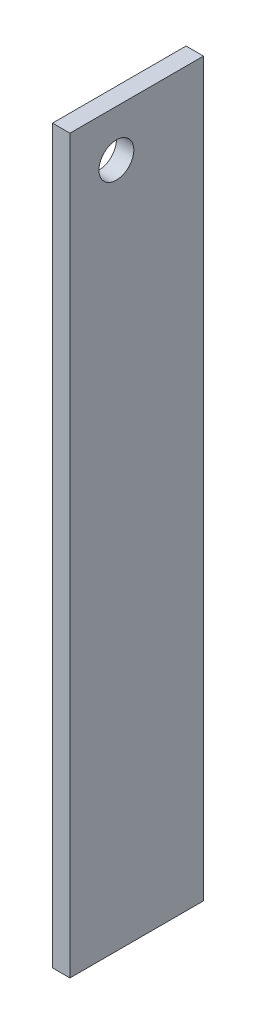
ISO-10303-21;
HEADER;
FILE_DESCRIPTION(('STEP AP214'),'2;1');
FILE_NAME('part.step','',(''),(''),'','','');
FILE_SCHEMA(('AUTOMOTIVE_DESIGN { 1 0 10303 214 1 1 1 1 }'));
ENDSEC;
DATA;
#1=APPLICATION_CONTEXT('core data for automotive mechanical design processes');
#2=APPLICATION_PROTOCOL_DEFINITION('international standard','automotive_design',2000,#1);
#3=PRODUCT_CONTEXT('',#1,'mechanical');
#4=PRODUCT('Part','Part','',(#3));
#5=PRODUCT_RELATED_PRODUCT_CATEGORY('part','',(#4));
#6=PRODUCT_DEFINITION_FORMATION('','',#4);
#7=PRODUCT_DEFINITION_CONTEXT('part definition',#1,'design');
#8=PRODUCT_DEFINITION('design','',#6,#7);
#9=PRODUCT_DEFINITION_SHAPE('','',#8);
#10=(LENGTH_UNIT() NAMED_UNIT(*) SI_UNIT(.MILLI.,.METRE.));
#11=(NAMED_UNIT(*) PLANE_ANGLE_UNIT() SI_UNIT($,.RADIAN.));
#12=(NAMED_UNIT(*) SI_UNIT($,.STERADIAN.) SOLID_ANGLE_UNIT());
#13=UNCERTAINTY_MEASURE_WITH_UNIT(LENGTH_MEASURE(1.E-05),#10,'distance_accuracy_value','');
#14=(GEOMETRIC_REPRESENTATION_CONTEXT(3) GLOBAL_UNCERTAINTY_ASSIGNED_CONTEXT((#13)) GLOBAL_UNIT_ASSIGNED_CONTEXT((#10,
#11,#12)) REPRESENTATION_CONTEXT('',''));
#15=CARTESIAN_POINT('',(0.,0.,0.));
#16=DIRECTION('',(0.,0.,1.));
#17=DIRECTION('',(1.,0.,0.));
#18=AXIS2_PLACEMENT_3D('',#15,#16,#17);
#19=CARTESIAN_POINT('',(76.1999999999999,6400.8,-584.2));
#20=DIRECTION('',(-1.,0.,0.));
#21=DIRECTION('',(0.,0.,1.));
#22=AXIS2_PLACEMENT_3D('',#19,#20,#21);
#23=PLANE('',#22);
#24=CARTESIAN_POINT('',(76.2000000000002,5994.4,177.8));
#25=DIRECTION('',(-1.,0.,0.));
#26=DIRECTION('',(0.,0.,1.));
#27=AXIS2_PLACEMENT_3D('',#24,#25,#26);
#28=CIRCLE('',#27,152.4);
#29=CARTESIAN_POINT('',(76.2000000000002,5994.4,330.2));
#30=VERTEX_POINT('',#29);
#31=EDGE_CURVE('E111',#30,#30,#28,.T.);
#32=ORIENTED_EDGE('',*,*,#31,.T.);
#33=EDGE_LOOP('',(#32));
#34=FACE_BOUND('',#33,.T.);
#35=DIRECTION('',(0.,0.,-1.));
#36=VECTOR('',#35,1.);
#37=CARTESIAN_POINT('',(76.1999999999999,0.,-584.2));
#38=LINE('',#37,#36);
#39=CARTESIAN_POINT('',(76.2000000000001,0.,584.2));
#40=VERTEX_POINT('',#39);
#41=CARTESIAN_POINT('',(76.1999999999999,0.,-584.2));
#42=VERTEX_POINT('',#41);
#43=EDGE_CURVE('E98',#40,#42,#38,.T.);
#44=ORIENTED_EDGE('',*,*,#43,.T.);
#45=DIRECTION('',(0.,-1.,0.));
#46=VECTOR('',#45,1.);
#47=CARTESIAN_POINT('',(76.1999999999999,6400.8,-584.2));
#48=LINE('',#47,#46);
#49=CARTESIAN_POINT('',(76.1999999999999,6400.8,-584.2));
#50=VERTEX_POINT('',#49);
#51=EDGE_CURVE('E11',#50,#42,#48,.T.);
#52=ORIENTED_EDGE('',*,*,#51,.F.);
#53=DIRECTION('',(0.,0.,-1.));
#54=VECTOR('',#53,1.);
#55=CARTESIAN_POINT('',(76.1999999999999,6400.8,-584.2));
#56=LINE('',#55,#54);
#57=CARTESIAN_POINT('',(76.2000000000001,6400.8,584.2));
#58=VERTEX_POINT('',#57);
#59=EDGE_CURVE('E85',#58,#50,#56,.T.);
#60=ORIENTED_EDGE('',*,*,#59,.F.);
#61=DIRECTION('',(0.,-1.,0.));
#62=VECTOR('',#61,1.);
#63=CARTESIAN_POINT('',(76.2000000000001,6400.8,584.2));
#64=LINE('',#63,#62);
#65=EDGE_CURVE('E94',#58,#40,#64,.T.);
#66=ORIENTED_EDGE('',*,*,#65,.T.);
#67=EDGE_LOOP('',(#44,#52,#60,#66));
#68=FACE_BOUND('',#67,.T.);
#69=ADVANCED_FACE('F33',(#34,#68),#23,.F.);
#70=CARTESIAN_POINT('',(-76.2000000000001,6400.8,-584.2));
#71=DIRECTION('',(0.,0.,1.));
#72=DIRECTION('',(1.,0.,0.));
#73=AXIS2_PLACEMENT_3D('',#70,#71,#72);
#74=PLANE('',#73);
#75=DIRECTION('',(-1.,0.,0.));
#76=VECTOR('',#75,1.);
#77=CARTESIAN_POINT('',(-76.2000000000001,0.,-584.2));
#78=LINE('',#77,#76);
#79=CARTESIAN_POINT('',(-76.2000000000001,0.,-584.2));
#80=VERTEX_POINT('',#79);
#81=EDGE_CURVE('E89',#42,#80,#78,.T.);
#82=ORIENTED_EDGE('',*,*,#81,.T.);
#83=DIRECTION('',(0.,-1.,0.));
#84=VECTOR('',#83,1.);
#85=CARTESIAN_POINT('',(-76.2000000000001,6400.8,-584.2));
#86=LINE('',#85,#84);
#87=CARTESIAN_POINT('',(-76.2000000000001,6400.8,-584.2));
#88=VERTEX_POINT('',#87);
#89=EDGE_CURVE('E42',#88,#80,#86,.T.);
#90=ORIENTED_EDGE('',*,*,#89,.F.);
#91=DIRECTION('',(-1.,0.,0.));
#92=VECTOR('',#91,1.);
#93=CARTESIAN_POINT('',(-76.2000000000001,6400.8,-584.2));
#94=LINE('',#93,#92);
#95=EDGE_CURVE('E80',#50,#88,#94,.T.);
#96=ORIENTED_EDGE('',*,*,#95,.F.);
#97=ORIENTED_EDGE('',*,*,#51,.T.);
#98=EDGE_LOOP('',(#82,#90,#96,#97));
#99=FACE_BOUND('',#98,.T.);
#100=ADVANCED_FACE('F88',(#99),#74,.F.);
#101=CARTESIAN_POINT('',(-76.2000000000001,6400.8,-584.2));
#102=DIRECTION('',(1.,0.,0.));
#103=DIRECTION('',(0.,0.,-1.));
#104=AXIS2_PLACEMENT_3D('',#101,#102,#103);
#105=PLANE('',#104);
#106=CARTESIAN_POINT('',(-76.2,5994.4,177.8));
#107=DIRECTION('',(1.,0.,0.));
#108=DIRECTION('',(0.,0.,-1.));
#109=AXIS2_PLACEMENT_3D('',#106,#107,#108);
#110=CIRCLE('',#109,152.4);
#111=CARTESIAN_POINT('',(-76.2,5994.4,25.4));
#112=VERTEX_POINT('',#111);
#113=EDGE_CURVE('E36',#112,#112,#110,.T.);
#114=ORIENTED_EDGE('',*,*,#113,.T.);
#115=EDGE_LOOP('',(#114));
#116=FACE_BOUND('',#115,.T.);
#117=DIRECTION('',(0.,0.,1.));
#118=VECTOR('',#117,1.);
#119=CARTESIAN_POINT('',(-76.2000000000001,0.,-584.2));
#120=LINE('',#119,#118);
#121=CARTESIAN_POINT('',(-76.1999999999999,0.,584.2));
#122=VERTEX_POINT('',#121);
#123=EDGE_CURVE('E67',#80,#122,#120,.T.);
#124=ORIENTED_EDGE('',*,*,#123,.T.);
#125=DIRECTION('',(0.,-1.,0.));
#126=VECTOR('',#125,1.);
#127=CARTESIAN_POINT('',(-76.1999999999999,6400.8,584.2));
#128=LINE('',#127,#126);
#129=CARTESIAN_POINT('',(-76.1999999999999,6400.8,584.2));
#130=VERTEX_POINT('',#129);
#131=EDGE_CURVE('E90',#130,#122,#128,.T.);
#132=ORIENTED_EDGE('',*,*,#131,.F.);
#133=DIRECTION('',(0.,0.,1.));
#134=VECTOR('',#133,1.);
#135=CARTESIAN_POINT('',(-76.2000000000001,6400.8,-584.2));
#136=LINE('',#135,#134);
#137=EDGE_CURVE('E83',#88,#130,#136,.T.);
#138=ORIENTED_EDGE('',*,*,#137,.F.);
#139=ORIENTED_EDGE('',*,*,#89,.T.);
#140=EDGE_LOOP('',(#124,#132,#138,#139));
#141=FACE_BOUND('',#140,.T.);
#142=ADVANCED_FACE('F92',(#116,#141),#105,.F.);
#143=CARTESIAN_POINT('',(-76.1999999999999,6400.8,584.2));
#144=DIRECTION('',(0.,0.,-1.));
#145=DIRECTION('',(-1.,0.,0.));
#146=AXIS2_PLACEMENT_3D('',#143,#144,#145);
#147=PLANE('',#146);
#148=DIRECTION('',(1.,0.,0.));
#149=VECTOR('',#148,1.);
#150=CARTESIAN_POINT('',(-76.1999999999999,0.,584.2));
#151=LINE('',#150,#149);
#152=EDGE_CURVE('E73',#122,#40,#151,.T.);
#153=ORIENTED_EDGE('',*,*,#152,.T.);
#154=ORIENTED_EDGE('',*,*,#65,.F.);
#155=DIRECTION('',(1.,0.,0.));
#156=VECTOR('',#155,1.);
#157=CARTESIAN_POINT('',(-76.1999999999999,6400.8,584.2));
#158=LINE('',#157,#156);
#159=EDGE_CURVE('E50',#130,#58,#158,.T.);
#160=ORIENTED_EDGE('',*,*,#159,.F.);
#161=ORIENTED_EDGE('',*,*,#131,.T.);
#162=EDGE_LOOP('',(#153,#154,#160,#161));
#163=FACE_BOUND('',#162,.T.);
#164=ADVANCED_FACE('F105',(#163),#147,.F.);
#165=CARTESIAN_POINT('',(0.,6400.8,0.));
#166=DIRECTION('',(0.,1.,0.));
#167=DIRECTION('',(0.,0.,1.));
#168=AXIS2_PLACEMENT_3D('',#165,#166,#167);
#169=PLANE('',#168);
#170=ORIENTED_EDGE('',*,*,#59,.T.);
#171=ORIENTED_EDGE('',*,*,#95,.T.);
#172=ORIENTED_EDGE('',*,*,#137,.T.);
#173=ORIENTED_EDGE('',*,*,#159,.T.);
#174=EDGE_LOOP('',(#170,#171,#172,#173));
#175=FACE_BOUND('',#174,.T.);
#176=ADVANCED_FACE('F81',(#175),#169,.T.);
#177=CARTESIAN_POINT('',(0.,0.,0.));
#178=DIRECTION('',(0.,1.,0.));
#179=DIRECTION('',(0.,0.,1.));
#180=AXIS2_PLACEMENT_3D('',#177,#178,#179);
#181=PLANE('',#180);
#182=ORIENTED_EDGE('',*,*,#43,.F.);
#183=ORIENTED_EDGE('',*,*,#152,.F.);
#184=ORIENTED_EDGE('',*,*,#123,.F.);
#185=ORIENTED_EDGE('',*,*,#81,.F.);
#186=EDGE_LOOP('',(#182,#183,#184,#185));
#187=FACE_BOUND('',#186,.T.);
#188=ADVANCED_FACE('F108',(#187),#181,.F.);
#189=CARTESIAN_POINT('',(76.2000000000002,5994.4,177.8));
#190=DIRECTION('',(-1.,0.,0.));
#191=DIRECTION('',(0.,0.,1.));
#192=AXIS2_PLACEMENT_3D('',#189,#190,#191);
#193=CYLINDRICAL_SURFACE('',#192,152.4);
#194=ORIENTED_EDGE('',*,*,#31,.F.);
#195=EDGE_LOOP('',(#194));
#196=FACE_BOUND('',#195,.T.);
#197=ORIENTED_EDGE('',*,*,#113,.F.);
#198=EDGE_LOOP('',(#197));
#199=FACE_BOUND('',#198,.T.);
#200=ADVANCED_FACE('F119',(#196,#199),#193,.F.);
#201=CLOSED_SHELL('',(#69,#100,#142,#164,#176,#188,#200));
#202=MANIFOLD_SOLID_BREP('B2',#201);
#203=ADVANCED_BREP_SHAPE_REPRESENTATION('',(#18,#202),#14);
#204=SHAPE_DEFINITION_REPRESENTATION(#9,#203);
ENDSEC;
END-ISO-10303-21;
